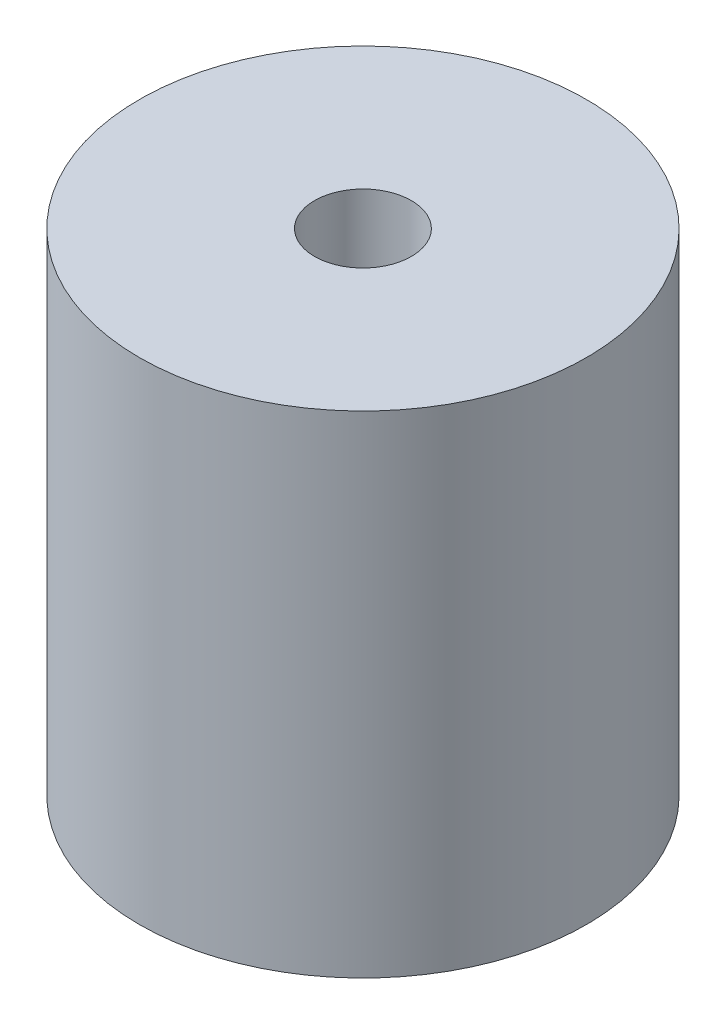
ISO-10303-21;
HEADER;
FILE_DESCRIPTION(('STEP AP214'),'2;1');
FILE_NAME('part.step','',(''),(''),'','','');
FILE_SCHEMA(('AUTOMOTIVE_DESIGN { 1 0 10303 214 1 1 1 1 }'));
ENDSEC;
DATA;
#1=APPLICATION_CONTEXT('core data for automotive mechanical design processes');
#2=APPLICATION_PROTOCOL_DEFINITION('international standard','automotive_design',2000,#1);
#3=PRODUCT_CONTEXT('',#1,'mechanical');
#4=PRODUCT('Part','Part','',(#3));
#5=PRODUCT_RELATED_PRODUCT_CATEGORY('part','',(#4));
#6=PRODUCT_DEFINITION_FORMATION('','',#4);
#7=PRODUCT_DEFINITION_CONTEXT('part definition',#1,'design');
#8=PRODUCT_DEFINITION('design','',#6,#7);
#9=PRODUCT_DEFINITION_SHAPE('','',#8);
#10=(LENGTH_UNIT() NAMED_UNIT(*) SI_UNIT(.MILLI.,.METRE.));
#11=(NAMED_UNIT(*) PLANE_ANGLE_UNIT() SI_UNIT($,.RADIAN.));
#12=(NAMED_UNIT(*) SI_UNIT($,.STERADIAN.) SOLID_ANGLE_UNIT());
#13=UNCERTAINTY_MEASURE_WITH_UNIT(LENGTH_MEASURE(1.E-05),#10,'distance_accuracy_value','');
#14=(GEOMETRIC_REPRESENTATION_CONTEXT(3) GLOBAL_UNCERTAINTY_ASSIGNED_CONTEXT((#13)) GLOBAL_UNIT_ASSIGNED_CONTEXT((#10,
#11,#12)) REPRESENTATION_CONTEXT('',''));
#15=CARTESIAN_POINT('',(0.,0.,0.));
#16=DIRECTION('',(0.,0.,1.));
#17=DIRECTION('',(1.,0.,0.));
#18=AXIS2_PLACEMENT_3D('',#15,#16,#17);
#19=CARTESIAN_POINT('',(0.,65.9,0.));
#20=DIRECTION('',(0.,1.,0.));
#21=DIRECTION('',(0.,0.,1.));
#22=AXIS2_PLACEMENT_3D('',#19,#20,#21);
#23=PLANE('',#22);
#24=CARTESIAN_POINT('',(0.,65.9,0.));
#25=DIRECTION('',(0.,1.,0.));
#26=DIRECTION('',(0.,0.,1.));
#27=AXIS2_PLACEMENT_3D('',#24,#25,#26);
#28=CIRCLE('',#27,30.);
#29=CARTESIAN_POINT('',(0.,65.9,30.));
#30=VERTEX_POINT('',#29);
#31=EDGE_CURVE('E10',#30,#30,#28,.T.);
#32=ORIENTED_EDGE('',*,*,#31,.T.);
#33=EDGE_LOOP('',(#32));
#34=FACE_BOUND('',#33,.T.);
#35=CARTESIAN_POINT('',(0.,65.9,0.));
#36=DIRECTION('',(0.,1.,0.));
#37=DIRECTION('',(0.,0.,1.));
#38=AXIS2_PLACEMENT_3D('',#35,#36,#37);
#39=CIRCLE('',#38,6.5);
#40=CARTESIAN_POINT('',(0.,65.9,6.5));
#41=VERTEX_POINT('',#40);
#42=EDGE_CURVE('E42',#41,#41,#39,.T.);
#43=ORIENTED_EDGE('',*,*,#42,.F.);
#44=EDGE_LOOP('',(#43));
#45=FACE_BOUND('',#44,.T.);
#46=ADVANCED_FACE('F31',(#34,#45),#23,.T.);
#47=CARTESIAN_POINT('',(0.,0.,0.));
#48=DIRECTION('',(0.,1.,0.));
#49=DIRECTION('',(0.,0.,1.));
#50=AXIS2_PLACEMENT_3D('',#47,#48,#49);
#51=PLANE('',#50);
#52=CARTESIAN_POINT('',(0.,0.,0.));
#53=DIRECTION('',(0.,1.,0.));
#54=DIRECTION('',(0.,0.,1.));
#55=AXIS2_PLACEMENT_3D('',#52,#53,#54);
#56=CIRCLE('',#55,30.);
#57=CARTESIAN_POINT('',(0.,0.,30.));
#58=VERTEX_POINT('',#57);
#59=EDGE_CURVE('E35',#58,#58,#56,.T.);
#60=ORIENTED_EDGE('',*,*,#59,.F.);
#61=EDGE_LOOP('',(#60));
#62=FACE_BOUND('',#61,.T.);
#63=CARTESIAN_POINT('',(0.,0.,0.));
#64=DIRECTION('',(0.,1.,0.));
#65=DIRECTION('',(0.,0.,1.));
#66=AXIS2_PLACEMENT_3D('',#63,#64,#65);
#67=CIRCLE('',#66,6.5);
#68=CARTESIAN_POINT('',(0.,0.,6.5));
#69=VERTEX_POINT('',#68);
#70=EDGE_CURVE('E44',#69,#69,#67,.T.);
#71=ORIENTED_EDGE('',*,*,#70,.T.);
#72=EDGE_LOOP('',(#71));
#73=FACE_BOUND('',#72,.T.);
#74=ADVANCED_FACE('F54',(#62,#73),#51,.F.);
#75=CARTESIAN_POINT('',(0.,65.9,0.));
#76=DIRECTION('',(0.,-1.,0.));
#77=DIRECTION('',(0.,0.,-1.));
#78=AXIS2_PLACEMENT_3D('',#75,#76,#77);
#79=CYLINDRICAL_SURFACE('',#78,30.);
#80=ORIENTED_EDGE('',*,*,#31,.F.);
#81=EDGE_LOOP('',(#80));
#82=FACE_BOUND('',#81,.T.);
#83=ORIENTED_EDGE('',*,*,#59,.T.);
#84=EDGE_LOOP('',(#83));
#85=FACE_BOUND('',#84,.T.);
#86=ADVANCED_FACE('F33',(#82,#85),#79,.T.);
#87=CARTESIAN_POINT('',(0.,65.9,0.));
#88=DIRECTION('',(0.,-1.,0.));
#89=DIRECTION('',(0.,0.,-1.));
#90=AXIS2_PLACEMENT_3D('',#87,#88,#89);
#91=CYLINDRICAL_SURFACE('',#90,6.5);
#92=ORIENTED_EDGE('',*,*,#42,.T.);
#93=EDGE_LOOP('',(#92));
#94=FACE_BOUND('',#93,.T.);
#95=ORIENTED_EDGE('',*,*,#70,.F.);
#96=EDGE_LOOP('',(#95));
#97=FACE_BOUND('',#96,.T.);
#98=ADVANCED_FACE('F50',(#94,#97),#91,.F.);
#99=CLOSED_SHELL('',(#46,#74,#86,#98));
#100=MANIFOLD_SOLID_BREP('B2',#99);
#101=ADVANCED_BREP_SHAPE_REPRESENTATION('',(#18,#100),#14);
#102=SHAPE_DEFINITION_REPRESENTATION(#9,#101);
ENDSEC;
END-ISO-10303-21;
